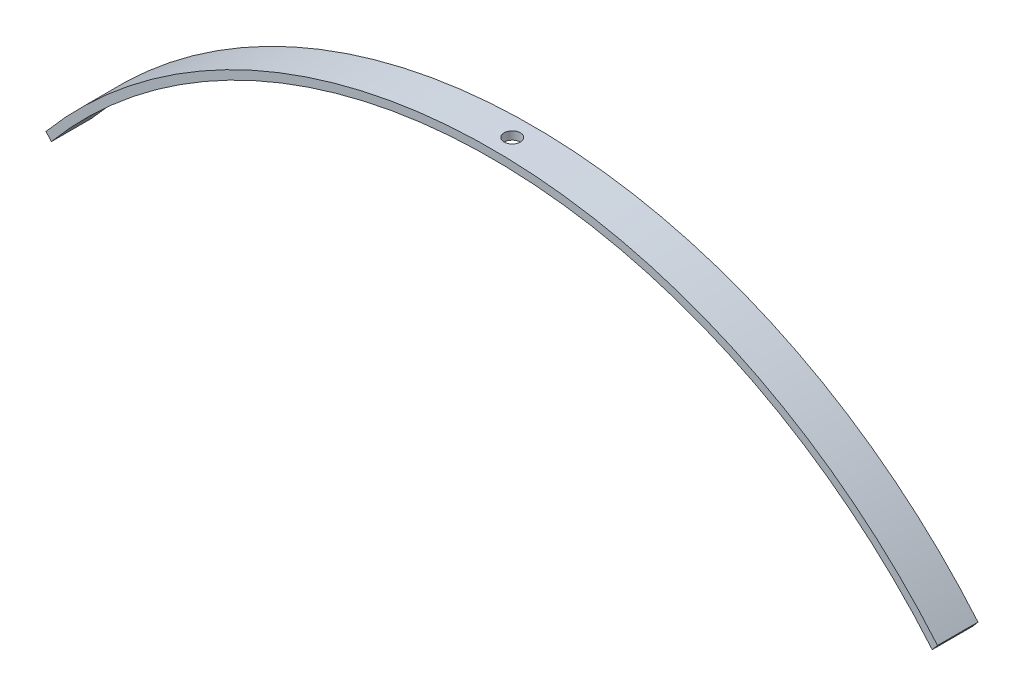
ISO-10303-21;
HEADER;
FILE_DESCRIPTION(('STEP AP214'),'2;1');
FILE_NAME('part.step','',(''),(''),'','','');
FILE_SCHEMA(('AUTOMOTIVE_DESIGN { 1 0 10303 214 1 1 1 1 }'));
ENDSEC;
DATA;
#1=APPLICATION_CONTEXT('core data for automotive mechanical design processes');
#2=APPLICATION_PROTOCOL_DEFINITION('international standard','automotive_design',2000,#1);
#3=PRODUCT_CONTEXT('',#1,'mechanical');
#4=PRODUCT('Part','Part','',(#3));
#5=PRODUCT_RELATED_PRODUCT_CATEGORY('part','',(#4));
#6=PRODUCT_DEFINITION_FORMATION('','',#4);
#7=PRODUCT_DEFINITION_CONTEXT('part definition',#1,'design');
#8=PRODUCT_DEFINITION('design','',#6,#7);
#9=PRODUCT_DEFINITION_SHAPE('','',#8);
#10=(LENGTH_UNIT() NAMED_UNIT(*) SI_UNIT(.MILLI.,.METRE.));
#11=(NAMED_UNIT(*) PLANE_ANGLE_UNIT() SI_UNIT($,.RADIAN.));
#12=(NAMED_UNIT(*) SI_UNIT($,.STERADIAN.) SOLID_ANGLE_UNIT());
#13=UNCERTAINTY_MEASURE_WITH_UNIT(LENGTH_MEASURE(1.E-05),#10,'distance_accuracy_value','');
#14=(GEOMETRIC_REPRESENTATION_CONTEXT(3) GLOBAL_UNCERTAINTY_ASSIGNED_CONTEXT((#13)) GLOBAL_UNIT_ASSIGNED_CONTEXT((#10,
#11,#12)) REPRESENTATION_CONTEXT('',''));
#15=CARTESIAN_POINT('',(0.,0.,0.));
#16=DIRECTION('',(0.,0.,1.));
#17=DIRECTION('',(1.,0.,0.));
#18=AXIS2_PLACEMENT_3D('',#15,#16,#17);
#19=CARTESIAN_POINT('',(0.,0.,10.));
#20=DIRECTION('',(0.,0.,-1.));
#21=DIRECTION('',(-1.,0.,0.));
#22=AXIS2_PLACEMENT_3D('',#19,#20,#21);
#23=CYLINDRICAL_SURFACE('',#22,142.);
#24=CARTESIAN_POINT('',(0.,0.,0.));
#25=DIRECTION('',(0.,0.,-1.));
#26=DIRECTION('',(1.,0.,0.));
#27=AXIS2_PLACEMENT_3D('',#24,#25,#26);
#28=CIRCLE('',#27,142.);
#29=CARTESIAN_POINT('',(-108.890707650477,91.1417236362052,0.));
#30=VERTEX_POINT('',#29);
#31=CARTESIAN_POINT('',(108.778310922895,91.2758405754884,0.));
#32=VERTEX_POINT('',#31);
#33=EDGE_CURVE('E101',#30,#32,#28,.T.);
#34=ORIENTED_EDGE('',*,*,#33,.T.);
#35=DIRECTION('',(0.,0.,-1.));
#36=VECTOR('',#35,1.);
#37=CARTESIAN_POINT('',(108.778310922895,91.2758405754884,10.));
#38=LINE('',#37,#36);
#39=CARTESIAN_POINT('',(108.778310922895,91.2758405754884,10.));
#40=VERTEX_POINT('',#39);
#41=EDGE_CURVE('E11',#40,#32,#38,.T.);
#42=ORIENTED_EDGE('',*,*,#41,.F.);
#43=CARTESIAN_POINT('',(0.,0.,10.));
#44=DIRECTION('',(0.,0.,-1.));
#45=DIRECTION('',(1.,0.,0.));
#46=AXIS2_PLACEMENT_3D('',#43,#44,#45);
#47=CIRCLE('',#46,142.);
#48=CARTESIAN_POINT('',(-108.890707650477,91.1417236362052,10.));
#49=VERTEX_POINT('',#48);
#50=EDGE_CURVE('E88',#49,#40,#47,.T.);
#51=ORIENTED_EDGE('',*,*,#50,.F.);
#52=DIRECTION('',(0.,0.,-1.));
#53=VECTOR('',#52,1.);
#54=CARTESIAN_POINT('',(-108.890707650477,91.1417236362052,10.));
#55=LINE('',#54,#53);
#56=EDGE_CURVE('E97',#49,#30,#55,.T.);
#57=ORIENTED_EDGE('',*,*,#56,.T.);
#58=EDGE_LOOP('',(#34,#42,#51,#57));
#59=FACE_BOUND('',#58,.T.);
#60=CARTESIAN_POINT('',(0.,142.,3.));
#61=CARTESIAN_POINT('',(-0.112334900707107,141.99999980968,3.00000497966911));
#62=CARTESIAN_POINT('',(-0.224751112997085,141.999865268303,3.00949610696757));
#63=CARTESIAN_POINT('',(-0.446487126462779,141.999341489945,3.04722616037735));
#64=CARTESIAN_POINT('',(-0.555803042088214,141.99895194692,3.07548761455298));
#65=CARTESIAN_POINT('',(-0.768094002679335,141.997962290921,3.14995325579183));
#66=CARTESIAN_POINT('',(-0.871072065005105,141.997362279074,3.19614882691938));
#67=CARTESIAN_POINT('',(-1.06778225555178,141.996019411269,3.30515942852805));
#68=CARTESIAN_POINT('',(-1.16151666570531,141.9952765907,3.3679703430949));
#69=CARTESIAN_POINT('',(-1.33712793660587,141.993731603554,3.50844595361473));
#70=CARTESIAN_POINT('',(-1.41900281936034,141.992929427112,3.58611312236846));
#71=CARTESIAN_POINT('',(-1.56855476970255,141.9913562291,3.75409371799125));
#72=CARTESIAN_POINT('',(-1.63623127800086,141.990585208758,3.84440764279622));
#73=CARTESIAN_POINT('',(-1.75546305419881,141.989161268975,4.03511845806521));
#74=CARTESIAN_POINT('',(-1.80701795261444,141.98850835224,4.13551557955187));
#75=CARTESIAN_POINT('',(-1.89254030737367,141.987394267499,4.34354106813226));
#76=CARTESIAN_POINT('',(-1.92650780682583,141.986933099022,4.45116941750075));
#77=CARTESIAN_POINT('',(-1.97588914220374,141.986254540324,4.67059482129419));
#78=CARTESIAN_POINT('',(-1.99130419064071,141.986037134171,4.7823916027953));
#79=CARTESIAN_POINT('',(-2.00314675292002,141.985870563896,5.00698631980792));
#80=CARTESIAN_POINT('',(-1.9995743101386,141.98592139916,5.11978425303175));
#81=CARTESIAN_POINT('',(-1.97354440934857,141.9862855642,5.34317108058273));
#82=CARTESIAN_POINT('',(-1.95108828529355,141.986598875435,5.45376013038172));
#83=CARTESIAN_POINT('',(-1.88793051838529,141.987452640971,5.66959850558469));
#84=CARTESIAN_POINT('',(-1.84722885165574,141.98799309557,5.77484782400082));
#85=CARTESIAN_POINT('',(-1.74873386166585,141.98924023866,5.97702322274246));
#86=CARTESIAN_POINT('',(-1.69093992727337,141.989946933095,6.07394900530092));
#87=CARTESIAN_POINT('',(-1.5599014687727,141.991446876835,6.25672261844904));
#88=CARTESIAN_POINT('',(-1.48665694175465,141.992240126156,6.34257044695235));
#89=CARTESIAN_POINT('',(-1.32678887872205,141.993823832294,6.50075904773099));
#90=CARTESIAN_POINT('',(-1.24016417946097,141.994614288862,6.57309864441754));
#91=CARTESIAN_POINT('',(-1.05599887935705,141.996103227069,6.70220824308468));
#92=CARTESIAN_POINT('',(-0.95845827702262,141.996801708695,6.75897824293779));
#93=CARTESIAN_POINT('',(-0.75522941957693,141.99802795283,6.85533697277367));
#94=CARTESIAN_POINT('',(-0.649541148059192,141.998555714995,6.89492566815842));
#95=CARTESIAN_POINT('',(-0.433017405720773,141.999381015149,6.95579724807924));
#96=CARTESIAN_POINT('',(-0.322181938168323,141.999678553284,6.97708014423847));
#97=CARTESIAN_POINT('',(-0.0985202839254602,142.0000098438,7.00073453726918));
#98=CARTESIAN_POINT('',(0.014305730877612,142.000043618846,7.00310765910063));
#99=CARTESIAN_POINT('',(0.238754662143133,141.999843635423,6.9888793696213));
#100=CARTESIAN_POINT('',(0.350377578870293,141.999609877012,6.97227796248546));
#101=CARTESIAN_POINT('',(0.569247163642419,141.998901193614,6.92057322051363));
#102=CARTESIAN_POINT('',(0.676494005445199,141.998426278211,6.88547062106354));
#103=CARTESIAN_POINT('',(0.883572351457834,141.997288817924,6.79776069967363));
#104=CARTESIAN_POINT('',(0.983403853127356,141.996626272976,6.7451533717371));
#105=CARTESIAN_POINT('',(1.17282510140089,141.995188180711,6.62392316282146));
#106=CARTESIAN_POINT('',(1.26241414786591,141.994412625678,6.55529918797353));
#107=CARTESIAN_POINT('',(1.42880033044762,141.992835969467,6.40398529171335));
#108=CARTESIAN_POINT('',(1.5055974553389,141.992034868267,6.32129535795783));
#109=CARTESIAN_POINT('',(1.64422515268701,141.990497371905,6.14418989611071));
#110=CARTESIAN_POINT('',(1.70605467426314,141.989760981288,6.04977354540702));
#111=CARTESIAN_POINT('',(1.8129847890715,141.988436000928,5.85189973239163));
#112=CARTESIAN_POINT('',(1.85808540439296,141.987847410991,5.74844228201822));
#113=CARTESIAN_POINT('',(1.93027566203066,141.986884423427,5.53542703782103));
#114=CARTESIAN_POINT('',(1.95736599139262,141.98651001763,5.42586947687346));
#115=CARTESIAN_POINT('',(1.99276894887408,141.986017586667,5.20376053645513));
#116=CARTESIAN_POINT('',(2.0010815542388,141.985899561811,5.09120915335664));
#117=CARTESIAN_POINT('',(1.99869295038964,141.985933203187,4.86631835883701));
#118=CARTESIAN_POINT('',(1.98799342123273,141.98608484559,4.75397892956418));
#119=CARTESIAN_POINT('',(1.94788767531171,141.986640675736,4.53269085667499));
#120=CARTESIAN_POINT('',(1.91848142103163,141.987044863986,4.42374221985927));
#121=CARTESIAN_POINT('',(1.84179666730554,141.988060222178,4.21232644082109));
#122=CARTESIAN_POINT('',(1.79451783887633,141.98867139593,4.10985941794722));
#123=CARTESIAN_POINT('',(1.68343216776689,141.990031791077,3.91432081513965));
#124=CARTESIAN_POINT('',(1.61962596274467,141.990781007146,3.82124887291813));
#125=CARTESIAN_POINT('',(1.4772978515027,141.992333038196,3.6471384219615));
#126=CARTESIAN_POINT('',(1.39877621122311,141.993135852208,3.56609969580723));
#127=CARTESIAN_POINT('',(1.22921939341821,141.994704801392,3.41833417131865));
#128=CARTESIAN_POINT('',(1.13818111310981,141.995470927406,3.35161093222238));
#129=CARTESIAN_POINT('',(0.946155090905964,141.996880276962,3.23436759774073));
#130=CARTESIAN_POINT('',(0.845162249909666,141.997523437017,3.18385586347201));
#131=CARTESIAN_POINT('',(0.636207787999349,141.998613055932,3.10056304310374));
#132=CARTESIAN_POINT('',(0.528254686110269,141.999059750207,3.06776072595743));
#133=CARTESIAN_POINT('',(0.349679099748481,141.999586180395,3.02954949524072));
#134=CARTESIAN_POINT('',(0.280216692042401,141.999740693188,3.01848228888044));
#135=CARTESIAN_POINT('',(0.140513462745026,141.999947662516,3.00370598394436));
#136=CARTESIAN_POINT('',(0.0702726412033474,142.000000119057,2.99999688489954));
#137=CARTESIAN_POINT('',(0.,142.,3.));
#138=B_SPLINE_CURVE_WITH_KNOTS('',3,(#60,#61,#62,#63,#64,#65,#66,#67,#68,#69,#70,#71,#72,#73,
#74,#75,#76,#77,#78,#79,#80,#81,#82,#83,#84,#85,#86,#87,#88,#89,#90,#91,#92,#93,#94,#95,#96,#97,
#98,#99,#100,#101,#102,#103,#104,#105,#106,#107,#108,#109,#110,#111,#112,#113,#114,#115,#116,
#117,#118,#119,#120,#121,#122,#123,#124,#125,#126,#127,#128,#129,#130,#131,#132,#133,#134,#135,
#136,#137),.UNSPECIFIED.,.T.,.F.,(4,2,2,2,2,2,2,2,2,2,2,2,2,2,2,2,2,2,2,2,2,2,2,2,2,2,2,2,2,2,2,
2,2,2,2,2,2,2,4),(0.,0.336748205126862,0.673901306098039,1.01089263150965,1.34780055625958,
1.68476460769247,2.02174193001519,2.35872697480538,2.69571119360576,3.03267338731952,
3.36963481125565,3.70657243405153,4.04351049776888,4.38046061012642,4.71741078594305,
5.05439027206689,5.39136980423658,5.72835001497952,6.06533001175858,6.40228105076664,
6.73923201563576,7.0761695883783,7.41310727654782,7.75006798286443,8.08702898487515,
8.4240136381791,8.76099784651942,9.09796919904822,9.43494095991742,9.77188294487694,
10.1088256055692,10.4457744687188,10.7827103336684,11.1196401100356,11.4566535599191,
11.7938405468957,12.1306223923746,12.3412798741915,12.5519373425811),.UNSPECIFIED.);
#139=CARTESIAN_POINT('',(0.,142.,3.));
#140=VERTEX_POINT('',#139);
#141=EDGE_CURVE('E104',#140,#140,#138,.T.);
#142=ORIENTED_EDGE('',*,*,#141,.T.);
#143=EDGE_LOOP('',(#142));
#144=FACE_BOUND('',#143,.T.);
#145=ADVANCED_FACE('F37',(#59,#144),#23,.F.);
#146=CARTESIAN_POINT('',(0.,0.,10.));
#147=DIRECTION('',(0.,0.,-1.));
#148=DIRECTION('',(-1.,0.,0.));
#149=AXIS2_PLACEMENT_3D('',#146,#147,#148);
#150=CYLINDRICAL_SURFACE('',#149,144.);
#151=CARTESIAN_POINT('',(0.,0.,0.));
#152=DIRECTION('',(0.,0.,1.));
#153=DIRECTION('',(1.,0.,0.));
#154=AXIS2_PLACEMENT_3D('',#151,#152,#153);
#155=CIRCLE('',#154,144.);
#156=CARTESIAN_POINT('',(110.083436481474,92.8312286487112,0.));
#157=VERTEX_POINT('',#156);
#158=CARTESIAN_POINT('',(-110.196113775177,92.6974460751115,0.));
#159=VERTEX_POINT('',#158);
#160=EDGE_CURVE('E70',#157,#159,#155,.T.);
#161=ORIENTED_EDGE('',*,*,#160,.T.);
#162=DIRECTION('',(0.,0.,-1.));
#163=VECTOR('',#162,1.);
#164=CARTESIAN_POINT('',(-110.196113775177,92.6974460751115,10.));
#165=LINE('',#164,#163);
#166=CARTESIAN_POINT('',(-110.196113775177,92.6974460751115,10.));
#167=VERTEX_POINT('',#166);
#168=EDGE_CURVE('E93',#167,#159,#165,.T.);
#169=ORIENTED_EDGE('',*,*,#168,.F.);
#170=CARTESIAN_POINT('',(0.,0.,10.));
#171=DIRECTION('',(0.,0.,1.));
#172=DIRECTION('',(1.,0.,0.));
#173=AXIS2_PLACEMENT_3D('',#170,#171,#172);
#174=CIRCLE('',#173,144.);
#175=CARTESIAN_POINT('',(110.083436481474,92.8312286487112,10.));
#176=VERTEX_POINT('',#175);
#177=EDGE_CURVE('E86',#176,#167,#174,.T.);
#178=ORIENTED_EDGE('',*,*,#177,.F.);
#179=DIRECTION('',(0.,0.,-1.));
#180=VECTOR('',#179,1.);
#181=CARTESIAN_POINT('',(110.083436481474,92.8312286487112,10.));
#182=LINE('',#181,#180);
#183=EDGE_CURVE('E45',#176,#157,#182,.T.);
#184=ORIENTED_EDGE('',*,*,#183,.T.);
#185=EDGE_LOOP('',(#161,#169,#178,#184));
#186=FACE_BOUND('',#185,.T.);
#187=CARTESIAN_POINT('',(0.,144.,3.));
#188=CARTESIAN_POINT('',(0.112335065577015,143.999999812319,3.00000497972511));
#189=CARTESIAN_POINT('',(0.224751446767672,143.999867139178,3.00949613477444));
#190=CARTESIAN_POINT('',(0.446487804690043,143.999350633987,3.04722630483586));
#191=CARTESIAN_POINT('',(0.555803895691801,143.998966500128,3.07548784902821));
#192=CARTESIAN_POINT('',(0.768095207925215,143.997990586513,3.14995374344272));
#193=CARTESIAN_POINT('',(0.871073446078931,143.997398906464,3.19614947895497));
#194=CARTESIAN_POINT('',(1.06778395339979,143.996074686216,3.30516048272652));
#195=CARTESIAN_POINT('',(1.16151850476219,143.995342180917,3.36797163459366));
#196=CARTESIAN_POINT('',(1.33712984432954,143.993818650584,3.50844765927814));
#197=CARTESIAN_POINT('',(1.41900467481998,143.99302761592,3.5861149795422));
#198=CARTESIAN_POINT('',(1.56855648279102,143.991476269873,3.75409586912071));
#199=CARTESIAN_POINT('',(1.63623290102829,143.990715959701,3.84440993632836));
#200=CARTESIAN_POINT('',(1.75546438810669,143.989311801773,4.03512089415343));
#201=CARTESIAN_POINT('',(1.80701910594674,143.988667956554,4.13551800423562));
#202=CARTESIAN_POINT('',(1.89254111333668,143.987569351662,4.34354340926733));
#203=CARTESIAN_POINT('',(1.92650844578142,143.987114591528,4.45117168657962));
#204=CARTESIAN_POINT('',(1.97588952659643,143.986445462281,4.67059709942663));
#205=CARTESIAN_POINT('',(1.99130445305956,143.986231077904,4.78239396978746));
#206=CARTESIAN_POINT('',(2.00314674807321,143.986066825248,5.00698883773036));
#207=CARTESIAN_POINT('',(1.99957415974728,143.986116956367,5.11978683303814));
#208=CARTESIAN_POINT('',(1.97354392020942,143.986476067211,5.34317398904002));
#209=CARTESIAN_POINT('',(1.95108756595303,143.986785029159,5.45376330089466));
#210=CARTESIAN_POINT('',(1.88792924020478,143.98762694173,5.66960216147185));
#211=CARTESIAN_POINT('',(1.84722724496373,143.988159892645,5.77485170324375));
#212=CARTESIAN_POINT('',(1.7487315515842,143.989389719009,5.9770273832075));
#213=CARTESIAN_POINT('',(1.6909372593162,143.990086600157,6.07395323191601));
#214=CARTESIAN_POINT('',(1.55989803660152,143.99156571452,6.25672690032341));
#215=CARTESIAN_POINT('',(1.48665310349771,143.992347947749,6.34257471811716));
#216=CARTESIAN_POINT('',(1.32678440071408,143.99390965738,6.50076300540134));
#217=CARTESIAN_POINT('',(1.24015949982925,143.994689133543,6.57310233167742));
#218=CARTESIAN_POINT('',(1.05599386176421,143.996157387221,6.7022113540698));
#219=CARTESIAN_POINT('',(0.958453123094301,143.996846164723,6.7589810480613));
#220=CARTESIAN_POINT('',(0.755224080316041,143.998055370777,6.85533914286143));
#221=CARTESIAN_POINT('',(0.649535760269777,143.998575798999,6.89492751005978));
#222=CARTESIAN_POINT('',(0.433012002005564,143.999389628439,6.95579843999077));
#223=CARTESIAN_POINT('',(0.322176566972031,143.999683029798,6.97708101404868));
#224=CARTESIAN_POINT('',(0.0985147768801511,144.000009711,7.00073481794949));
#225=CARTESIAN_POINT('',(-0.0143114110367249,144.000043012577,7.00310762793508));
#226=CARTESIAN_POINT('',(-0.238760636946411,143.999845797364,6.98887866193738));
#227=CARTESIAN_POINT('',(-0.350383675195143,143.99961528063,6.97227688999026));
#228=CARTESIAN_POINT('',(-0.569253572282311,143.998916429746,6.92057133888664));
#229=CARTESIAN_POINT('',(-0.676500600079365,143.998448104786,6.88546827479833));
#230=CARTESIAN_POINT('',(-0.88357923436219,143.997326431774,6.79775733737489));
#231=CARTESIAN_POINT('',(-0.983410838404302,143.996673083659,6.74514945827132));
#232=CARTESIAN_POINT('',(-1.17283199795849,143.995254957445,6.62391819179004));
#233=CARTESIAN_POINT('',(-1.2624208726661,143.994490171946,6.55529374075829));
#234=CARTESIAN_POINT('',(-1.42880661709964,143.99293541224,6.40397890608066));
#235=CARTESIAN_POINT('',(-1.50560347576704,143.992145438013,6.32128851027509));
#236=CARTESIAN_POINT('',(-1.64423040384899,143.990629301263,6.14418234351336));
#237=CARTESIAN_POINT('',(-1.70605945124393,143.989903143101,6.04976577254589));
#238=CARTESIAN_POINT('',(-1.81298859100129,143.988596576741,5.85189162992443));
#239=CARTESIAN_POINT('',(-1.85808870533089,143.988016168352,5.74843407014261));
#240=CARTESIAN_POINT('',(-1.93027799954287,143.987066569215,5.53541861199103));
#241=CARTESIAN_POINT('',(-1.95736784773163,143.986697370629,5.42586094014144));
#242=CARTESIAN_POINT('',(-1.99276983372621,143.986211793266,5.20375187542607));
#243=CARTESIAN_POINT('',(-2.00108194847141,143.9860954148,5.09120047888391));
#244=CARTESIAN_POINT('',(-1.99869236960818,143.986128602387,4.86630946908113));
#245=CARTESIAN_POINT('',(-1.9879923107026,143.986278145576,4.75396983844386));
#246=CARTESIAN_POINT('',(-1.94788543302382,143.986826269407,4.5326814484859));
#247=CARTESIAN_POINT('',(-1.91847857673158,143.987224850549,4.42373269596653));
#248=CARTESIAN_POINT('',(-1.84179255373168,143.988226118843,4.21231678241935));
#249=CARTESIAN_POINT('',(-1.79451305790444,143.988828809755,4.10984974079097));
#250=CARTESIAN_POINT('',(-1.68342600233339,143.990170320244,3.91431122393662));
#251=CARTESIAN_POINT('',(-1.61961908056168,143.990909134567,3.8212393862408));
#252=CARTESIAN_POINT('',(-1.47728968722957,143.992439613385,3.64712950240925));
#253=CARTESIAN_POINT('',(-1.39876751674748,143.993231276797,3.56609121012444));
#254=CARTESIAN_POINT('',(-1.22920971796208,143.994778431326,3.41832664813249));
#255=CARTESIAN_POINT('',(-1.13817098682393,143.995533913411,3.35160393776917));
#256=CARTESIAN_POINT('',(-0.94614427494424,143.9969236786,3.23436180657678));
#257=CARTESIAN_POINT('',(-0.845151205399444,143.997557899221,3.18385073011804));
#258=CARTESIAN_POINT('',(-0.636196434238991,143.998632369472,3.10055924653892));
#259=CARTESIAN_POINT('',(-0.528243251750582,143.999072851256,3.06775760766258));
#260=CARTESIAN_POINT('',(-0.349669472980132,143.999591950411,3.02954785631623));
#261=CARTESIAN_POINT('',(-0.280208949153843,143.999744308813,3.0184812630948));
#262=CARTESIAN_POINT('',(-0.140509556645127,143.999948392306,3.0037057776425));
#263=CARTESIAN_POINT('',(-0.0702706880109355,144.000000117403,2.99999688495566));
#264=CARTESIAN_POINT('',(0.,144.,3.));
#265=B_SPLINE_CURVE_WITH_KNOTS('',3,(#187,#188,#189,#190,#191,#192,#193,#194,#195,#196,#197,
#198,#199,#200,#201,#202,#203,#204,#205,#206,#207,#208,#209,#210,#211,#212,#213,#214,#215,#216,
#217,#218,#219,#220,#221,#222,#223,#224,#225,#226,#227,#228,#229,#230,#231,#232,#233,#234,#235,
#236,#237,#238,#239,#240,#241,#242,#243,#244,#245,#246,#247,#248,#249,#250,#251,#252,#253,#254,
#255,#256,#257,#258,#259,#260,#261,#262,#263,#264),.UNSPECIFIED.,.T.,.F.,(4,2,2,2,2,2,2,2,2,2,2,
2,2,2,2,2,2,2,2,2,2,2,2,2,2,2,2,2,2,2,2,2,2,2,2,2,2,2,4),(0.,0.336748706922177,
0.673902329039431,1.01089419900396,1.34780265886312,1.68476666984152,2.02174395057903,
2.3587285674626,2.69571236245163,3.03267475756671,3.36963638738909,3.70657487624674,
4.04351380367692,4.38046444450629,4.71741514328277,5.05439434505458,5.39137359281437,
5.72835349977366,6.06533319825308,6.40228473765082,6.73923620537412,7.07617465100112,
7.41311320766146,7.75007414664506,8.08703537692541,8.42401960882591,8.76100339822222,
9.09797468247378,9.43494638055405,9.77188910656854,10.1088325083697,10.4457821151901,
10.7827187174195,11.1196484265799,11.4566618111715,11.7938483844315,12.1306298036165,
12.3412814346737,12.5519330526761),.UNSPECIFIED.);
#266=CARTESIAN_POINT('',(0.,144.,3.));
#267=VERTEX_POINT('',#266);
#268=EDGE_CURVE('E122',#267,#267,#265,.T.);
#269=ORIENTED_EDGE('',*,*,#268,.T.);
#270=EDGE_LOOP('',(#269));
#271=FACE_BOUND('',#270,.T.);
#272=ADVANCED_FACE('F94',(#186,#271),#150,.T.);
#273=CARTESIAN_POINT('',(108.778310922895,91.2758405754884,10.));
#274=DIRECTION('',(-0.766044443118977,0.642787609686541,0.));
#275=DIRECTION('',(-0.642787609686541,-0.766044443118977,0.));
#276=AXIS2_PLACEMENT_3D('',#273,#274,#275);
#277=PLANE('',#276);
#278=DIRECTION('',(0.642787609686541,0.766044443118977,0.));
#279=VECTOR('',#278,1.);
#280=CARTESIAN_POINT('',(108.778310922895,91.2758405754884,0.));
#281=LINE('',#280,#279);
#282=EDGE_CURVE('E92',#32,#157,#281,.T.);
#283=ORIENTED_EDGE('',*,*,#282,.T.);
#284=ORIENTED_EDGE('',*,*,#183,.F.);
#285=DIRECTION('',(0.642787609686541,0.766044443118977,0.));
#286=VECTOR('',#285,1.);
#287=CARTESIAN_POINT('',(108.778310922895,91.2758405754884,10.));
#288=LINE('',#287,#286);
#289=EDGE_CURVE('E83',#40,#176,#288,.T.);
#290=ORIENTED_EDGE('',*,*,#289,.F.);
#291=ORIENTED_EDGE('',*,*,#41,.T.);
#292=EDGE_LOOP('',(#283,#284,#290,#291));
#293=FACE_BOUND('',#292,.T.);
#294=ADVANCED_FACE('F91',(#293),#277,.F.);
#295=CARTESIAN_POINT('',(-108.890707650477,91.1417236362052,10.));
#296=DIRECTION('',(0.766044443118978,0.642787609686539,0.));
#297=DIRECTION('',(-0.642787609686539,0.766044443118978,0.));
#298=AXIS2_PLACEMENT_3D('',#295,#296,#297);
#299=PLANE('',#298);
#300=DIRECTION('',(0.642787609686539,-0.766044443118978,0.));
#301=VECTOR('',#300,1.);
#302=CARTESIAN_POINT('',(-108.890707650477,91.1417236362052,0.));
#303=LINE('',#302,#301);
#304=EDGE_CURVE('E76',#159,#30,#303,.T.);
#305=ORIENTED_EDGE('',*,*,#304,.T.);
#306=ORIENTED_EDGE('',*,*,#56,.F.);
#307=DIRECTION('',(0.642787609686539,-0.766044443118978,0.));
#308=VECTOR('',#307,1.);
#309=CARTESIAN_POINT('',(-108.890707650477,91.1417236362052,10.));
#310=LINE('',#309,#308);
#311=EDGE_CURVE('E53',#167,#49,#310,.T.);
#312=ORIENTED_EDGE('',*,*,#311,.F.);
#313=ORIENTED_EDGE('',*,*,#168,.T.);
#314=EDGE_LOOP('',(#305,#306,#312,#313));
#315=FACE_BOUND('',#314,.T.);
#316=ADVANCED_FACE('F109',(#315),#299,.F.);
#317=CARTESIAN_POINT('',(0.,0.,10.));
#318=DIRECTION('',(0.,0.,1.));
#319=DIRECTION('',(1.,0.,0.));
#320=AXIS2_PLACEMENT_3D('',#317,#318,#319);
#321=PLANE('',#320);
#322=ORIENTED_EDGE('',*,*,#50,.T.);
#323=ORIENTED_EDGE('',*,*,#289,.T.);
#324=ORIENTED_EDGE('',*,*,#177,.T.);
#325=ORIENTED_EDGE('',*,*,#311,.T.);
#326=EDGE_LOOP('',(#322,#323,#324,#325));
#327=FACE_BOUND('',#326,.T.);
#328=ADVANCED_FACE('F84',(#327),#321,.T.);
#329=CARTESIAN_POINT('',(0.,0.,0.));
#330=DIRECTION('',(0.,0.,1.));
#331=DIRECTION('',(1.,0.,0.));
#332=AXIS2_PLACEMENT_3D('',#329,#330,#331);
#333=PLANE('',#332);
#334=ORIENTED_EDGE('',*,*,#33,.F.);
#335=ORIENTED_EDGE('',*,*,#304,.F.);
#336=ORIENTED_EDGE('',*,*,#160,.F.);
#337=ORIENTED_EDGE('',*,*,#282,.F.);
#338=EDGE_LOOP('',(#334,#335,#336,#337));
#339=FACE_BOUND('',#338,.T.);
#340=ADVANCED_FACE('F112',(#339),#333,.F.);
#341=CARTESIAN_POINT('',(0.,144.001,5.));
#342=DIRECTION('',(0.,-1.,0.));
#343=DIRECTION('',(0.,0.,-1.));
#344=AXIS2_PLACEMENT_3D('',#341,#342,#343);
#345=CYLINDRICAL_SURFACE('',#344,2.);
#346=ORIENTED_EDGE('',*,*,#268,.F.);
#347=EDGE_LOOP('',(#346));
#348=FACE_BOUND('',#347,.T.);
#349=ORIENTED_EDGE('',*,*,#141,.F.);
#350=EDGE_LOOP('',(#349));
#351=FACE_BOUND('',#350,.T.);
#352=ADVANCED_FACE('F126',(#348,#351),#345,.F.);
#353=CLOSED_SHELL('',(#145,#272,#294,#316,#328,#340,#352));
#354=MANIFOLD_SOLID_BREP('B2',#353);
#355=ADVANCED_BREP_SHAPE_REPRESENTATION('',(#18,#354),#14);
#356=SHAPE_DEFINITION_REPRESENTATION(#9,#355);
ENDSEC;
END-ISO-10303-21;
